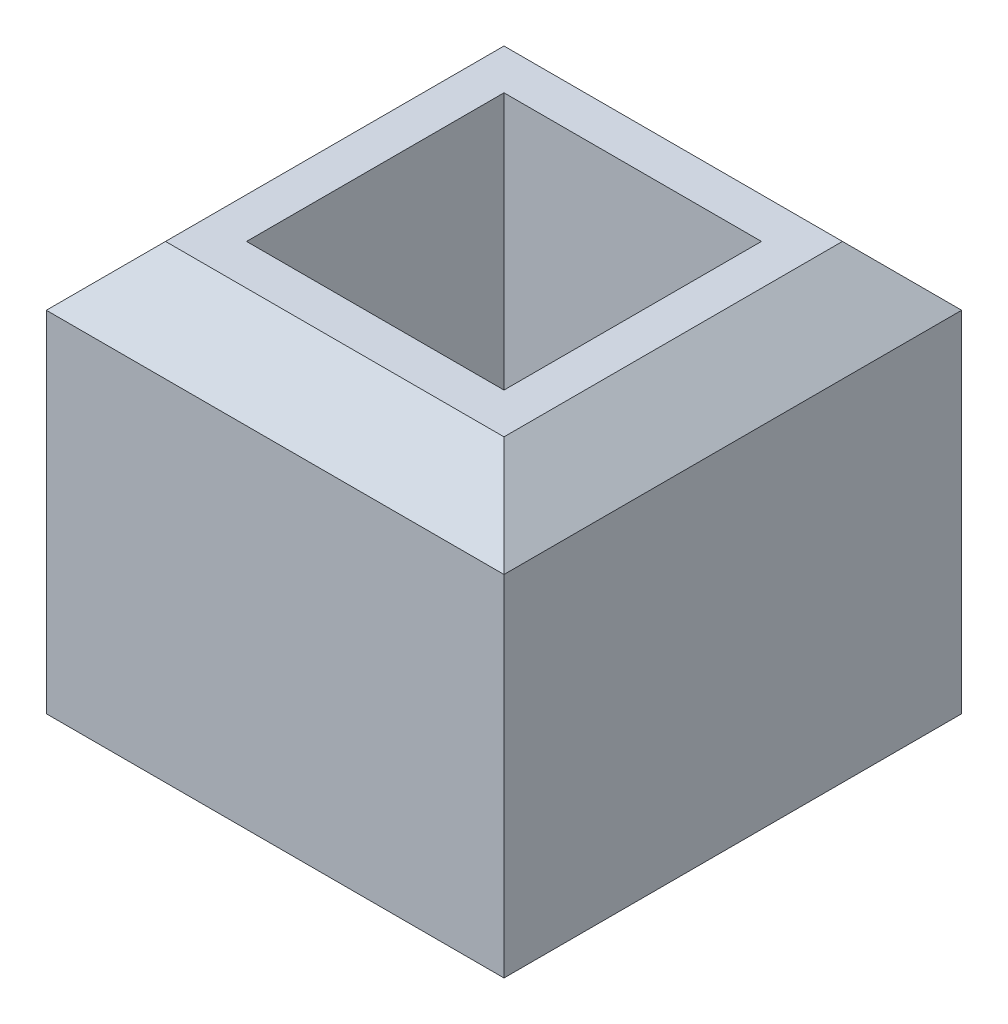
ISO-10303-21;
HEADER;
FILE_DESCRIPTION(('STEP AP214'),'2;1');
FILE_NAME('part.step','',(''),(''),'','','');
FILE_SCHEMA(('AUTOMOTIVE_DESIGN { 1 0 10303 214 1 1 1 1 }'));
ENDSEC;
DATA;
#1=APPLICATION_CONTEXT('core data for automotive mechanical design processes');
#2=APPLICATION_PROTOCOL_DEFINITION('international standard','automotive_design',2000,#1);
#3=PRODUCT_CONTEXT('',#1,'mechanical');
#4=PRODUCT('Part','Part','',(#3));
#5=PRODUCT_RELATED_PRODUCT_CATEGORY('part','',(#4));
#6=PRODUCT_DEFINITION_FORMATION('','',#4);
#7=PRODUCT_DEFINITION_CONTEXT('part definition',#1,'design');
#8=PRODUCT_DEFINITION('design','',#6,#7);
#9=PRODUCT_DEFINITION_SHAPE('','',#8);
#10=(LENGTH_UNIT() NAMED_UNIT(*) SI_UNIT(.MILLI.,.METRE.));
#11=(NAMED_UNIT(*) PLANE_ANGLE_UNIT() SI_UNIT($,.RADIAN.));
#12=(NAMED_UNIT(*) SI_UNIT($,.STERADIAN.) SOLID_ANGLE_UNIT());
#13=UNCERTAINTY_MEASURE_WITH_UNIT(LENGTH_MEASURE(1.E-05),#10,'distance_accuracy_value','');
#14=(GEOMETRIC_REPRESENTATION_CONTEXT(3) GLOBAL_UNCERTAINTY_ASSIGNED_CONTEXT((#13)) GLOBAL_UNIT_ASSIGNED_CONTEXT((#10,
#11,#12)) REPRESENTATION_CONTEXT('',''));
#15=CARTESIAN_POINT('',(0.,0.,0.));
#16=DIRECTION('',(0.,0.,1.));
#17=DIRECTION('',(1.,0.,0.));
#18=AXIS2_PLACEMENT_3D('',#15,#16,#17);
#19=CARTESIAN_POINT('',(0.,5.4483,0.));
#20=DIRECTION('',(0.,1.,0.));
#21=DIRECTION('',(0.,0.,1.));
#22=AXIS2_PLACEMENT_3D('',#19,#20,#21);
#23=PLANE('',#22);
#24=DIRECTION('',(-1.,0.,0.));
#25=VECTOR('',#24,1.);
#26=CARTESIAN_POINT('',(-3.048,5.4483,-2.25425));
#27=LINE('',#26,#25);
#28=CARTESIAN_POINT('',(2.25425,5.4483,-2.25425));
#29=VERTEX_POINT('',#28);
#30=CARTESIAN_POINT('',(-2.25425,5.4483,-2.25425));
#31=VERTEX_POINT('',#30);
#32=EDGE_CURVE('E214',#29,#31,#27,.T.);
#33=ORIENTED_EDGE('',*,*,#32,.T.);
#34=DIRECTION('',(0.,0.,1.));
#35=VECTOR('',#34,1.);
#36=CARTESIAN_POINT('',(-2.25425,5.4483,3.048));
#37=LINE('',#36,#35);
#38=CARTESIAN_POINT('',(-2.25425,5.4483,2.25425));
#39=VERTEX_POINT('',#38);
#40=EDGE_CURVE('E217',#31,#39,#37,.T.);
#41=ORIENTED_EDGE('',*,*,#40,.T.);
#42=DIRECTION('',(1.,0.,0.));
#43=VECTOR('',#42,1.);
#44=CARTESIAN_POINT('',(3.048,5.4483,2.25425));
#45=LINE('',#44,#43);
#46=CARTESIAN_POINT('',(2.25425,5.4483,2.25425));
#47=VERTEX_POINT('',#46);
#48=EDGE_CURVE('E208',#39,#47,#45,.T.);
#49=ORIENTED_EDGE('',*,*,#48,.T.);
#50=DIRECTION('',(0.,0.,-1.));
#51=VECTOR('',#50,1.);
#52=CARTESIAN_POINT('',(2.25425,5.4483,-3.048));
#53=LINE('',#52,#51);
#54=EDGE_CURVE('E211',#47,#29,#53,.T.);
#55=ORIENTED_EDGE('',*,*,#54,.T.);
#56=EDGE_LOOP('',(#33,#41,#49,#55));
#57=FACE_BOUND('',#56,.T.);
#58=DIRECTION('',(-1.,0.,0.));
#59=VECTOR('',#58,1.);
#60=CARTESIAN_POINT('',(-1.7145,5.4483,-1.7145));
#61=LINE('',#60,#59);
#62=CARTESIAN_POINT('',(1.7145,5.4483,-1.7145));
#63=VERTEX_POINT('',#62);
#64=CARTESIAN_POINT('',(-1.7145,5.4483,-1.7145));
#65=VERTEX_POINT('',#64);
#66=EDGE_CURVE('E139',#63,#65,#61,.T.);
#67=ORIENTED_EDGE('',*,*,#66,.F.);
#68=DIRECTION('',(0.,0.,-1.));
#69=VECTOR('',#68,1.);
#70=CARTESIAN_POINT('',(1.7145,5.4483,-1.7145));
#71=LINE('',#70,#69);
#72=CARTESIAN_POINT('',(1.7145,5.4483,1.7145));
#73=VERTEX_POINT('',#72);
#74=EDGE_CURVE('E128',#73,#63,#71,.T.);
#75=ORIENTED_EDGE('',*,*,#74,.F.);
#76=DIRECTION('',(1.,0.,0.));
#77=VECTOR('',#76,1.);
#78=CARTESIAN_POINT('',(-1.7145,5.4483,1.7145));
#79=LINE('',#78,#77);
#80=CARTESIAN_POINT('',(-1.7145,5.4483,1.7145));
#81=VERTEX_POINT('',#80);
#82=EDGE_CURVE('E157',#81,#73,#79,.T.);
#83=ORIENTED_EDGE('',*,*,#82,.F.);
#84=DIRECTION('',(0.,0.,1.));
#85=VECTOR('',#84,1.);
#86=CARTESIAN_POINT('',(-1.7145,5.4483,-1.7145));
#87=LINE('',#86,#85);
#88=EDGE_CURVE('E153',#65,#81,#87,.T.);
#89=ORIENTED_EDGE('',*,*,#88,.F.);
#90=EDGE_LOOP('',(#67,#75,#83,#89));
#91=FACE_BOUND('',#90,.T.);
#92=ADVANCED_FACE('F47',(#57,#91),#23,.T.);
#93=CARTESIAN_POINT('',(0.,0.,0.));
#94=DIRECTION('',(0.,1.,0.));
#95=DIRECTION('',(0.,0.,1.));
#96=AXIS2_PLACEMENT_3D('',#93,#94,#95);
#97=PLANE('',#96);
#98=DIRECTION('',(0.,0.,-1.));
#99=VECTOR('',#98,1.);
#100=CARTESIAN_POINT('',(3.048,0.,-3.048));
#101=LINE('',#100,#99);
#102=CARTESIAN_POINT('',(3.048,0.,3.048));
#103=VERTEX_POINT('',#102);
#104=CARTESIAN_POINT('',(3.048,0.,-3.048));
#105=VERTEX_POINT('',#104);
#106=EDGE_CURVE('E148',#103,#105,#101,.T.);
#107=ORIENTED_EDGE('',*,*,#106,.F.);
#108=DIRECTION('',(1.,0.,0.));
#109=VECTOR('',#108,1.);
#110=CARTESIAN_POINT('',(-3.048,0.,3.048));
#111=LINE('',#110,#109);
#112=CARTESIAN_POINT('',(-3.048,0.,3.048));
#113=VERTEX_POINT('',#112);
#114=EDGE_CURVE('E192',#113,#103,#111,.T.);
#115=ORIENTED_EDGE('',*,*,#114,.F.);
#116=DIRECTION('',(0.,0.,1.));
#117=VECTOR('',#116,1.);
#118=CARTESIAN_POINT('',(-3.048,0.,-3.048));
#119=LINE('',#118,#117);
#120=CARTESIAN_POINT('',(-3.048,0.,-3.048));
#121=VERTEX_POINT('',#120);
#122=EDGE_CURVE('E188',#121,#113,#119,.T.);
#123=ORIENTED_EDGE('',*,*,#122,.F.);
#124=DIRECTION('',(-1.,0.,0.));
#125=VECTOR('',#124,1.);
#126=CARTESIAN_POINT('',(-3.048,0.,-3.048));
#127=LINE('',#126,#125);
#128=EDGE_CURVE('E184',#105,#121,#127,.T.);
#129=ORIENTED_EDGE('',*,*,#128,.F.);
#130=EDGE_LOOP('',(#107,#115,#123,#129));
#131=FACE_BOUND('',#130,.T.);
#132=DIRECTION('',(0.,0.,-1.));
#133=VECTOR('',#132,1.);
#134=CARTESIAN_POINT('',(1.7145,0.,-1.7145));
#135=LINE('',#134,#133);
#136=CARTESIAN_POINT('',(1.7145,0.,1.7145));
#137=VERTEX_POINT('',#136);
#138=CARTESIAN_POINT('',(1.7145,0.,-1.7145));
#139=VERTEX_POINT('',#138);
#140=EDGE_CURVE('E162',#137,#139,#135,.T.);
#141=ORIENTED_EDGE('',*,*,#140,.T.);
#142=DIRECTION('',(-1.,0.,0.));
#143=VECTOR('',#142,1.);
#144=CARTESIAN_POINT('',(-1.7145,0.,-1.7145));
#145=LINE('',#144,#143);
#146=CARTESIAN_POINT('',(-1.7145,0.,-1.7145));
#147=VERTEX_POINT('',#146);
#148=EDGE_CURVE('E146',#139,#147,#145,.T.);
#149=ORIENTED_EDGE('',*,*,#148,.T.);
#150=DIRECTION('',(0.,0.,1.));
#151=VECTOR('',#150,1.);
#152=CARTESIAN_POINT('',(-1.7145,0.,-1.7145));
#153=LINE('',#152,#151);
#154=CARTESIAN_POINT('',(-1.7145,0.,1.7145));
#155=VERTEX_POINT('',#154);
#156=EDGE_CURVE('E167',#147,#155,#153,.T.);
#157=ORIENTED_EDGE('',*,*,#156,.T.);
#158=DIRECTION('',(1.,0.,0.));
#159=VECTOR('',#158,1.);
#160=CARTESIAN_POINT('',(-1.7145,0.,1.7145));
#161=LINE('',#160,#159);
#162=EDGE_CURVE('E140',#155,#137,#161,.T.);
#163=ORIENTED_EDGE('',*,*,#162,.T.);
#164=EDGE_LOOP('',(#141,#149,#157,#163));
#165=FACE_BOUND('',#164,.T.);
#166=ADVANCED_FACE('F265',(#131,#165),#97,.F.);
#167=CARTESIAN_POINT('',(3.048,5.4483,-3.048));
#168=DIRECTION('',(-1.,0.,0.));
#169=DIRECTION('',(0.,0.,1.));
#170=AXIS2_PLACEMENT_3D('',#167,#168,#169);
#171=PLANE('',#170);
#172=DIRECTION('',(0.,-1.,0.));
#173=VECTOR('',#172,1.);
#174=CARTESIAN_POINT('',(3.048,5.4483,-3.048));
#175=LINE('',#174,#173);
#176=CARTESIAN_POINT('',(3.048,4.65455,-3.048));
#177=VERTEX_POINT('',#176);
#178=EDGE_CURVE('E205',#177,#105,#175,.T.);
#179=ORIENTED_EDGE('',*,*,#178,.F.);
#180=DIRECTION('',(0.,0.,1.));
#181=VECTOR('',#180,1.);
#182=CARTESIAN_POINT('',(3.048,4.65455,3.048));
#183=LINE('',#182,#181);
#184=CARTESIAN_POINT('',(3.048,4.65455,3.048));
#185=VERTEX_POINT('',#184);
#186=EDGE_CURVE('E58',#177,#185,#183,.T.);
#187=ORIENTED_EDGE('',*,*,#186,.T.);
#188=DIRECTION('',(0.,-1.,0.));
#189=VECTOR('',#188,1.);
#190=CARTESIAN_POINT('',(3.048,5.4483,3.048));
#191=LINE('',#190,#189);
#192=EDGE_CURVE('E196',#185,#103,#191,.T.);
#193=ORIENTED_EDGE('',*,*,#192,.T.);
#194=ORIENTED_EDGE('',*,*,#106,.T.);
#195=EDGE_LOOP('',(#179,#187,#193,#194));
#196=FACE_BOUND('',#195,.T.);
#197=ADVANCED_FACE('F272',(#196),#171,.F.);
#198=CARTESIAN_POINT('',(-3.048,5.4483,-3.048));
#199=DIRECTION('',(0.,0.,1.));
#200=DIRECTION('',(1.,0.,0.));
#201=AXIS2_PLACEMENT_3D('',#198,#199,#200);
#202=PLANE('',#201);
#203=DIRECTION('',(0.,-1.,0.));
#204=VECTOR('',#203,1.);
#205=CARTESIAN_POINT('',(-3.048,5.4483,-3.048));
#206=LINE('',#205,#204);
#207=CARTESIAN_POINT('',(-3.048,4.65455,-3.048));
#208=VERTEX_POINT('',#207);
#209=EDGE_CURVE('E202',#208,#121,#206,.T.);
#210=ORIENTED_EDGE('',*,*,#209,.F.);
#211=DIRECTION('',(1.,0.,0.));
#212=VECTOR('',#211,1.);
#213=CARTESIAN_POINT('',(3.048,4.65455,-3.048));
#214=LINE('',#213,#212);
#215=EDGE_CURVE('E73',#208,#177,#214,.T.);
#216=ORIENTED_EDGE('',*,*,#215,.T.);
#217=ORIENTED_EDGE('',*,*,#178,.T.);
#218=ORIENTED_EDGE('',*,*,#128,.T.);
#219=EDGE_LOOP('',(#210,#216,#217,#218));
#220=FACE_BOUND('',#219,.T.);
#221=ADVANCED_FACE('F282',(#220),#202,.F.);
#222=CARTESIAN_POINT('',(-3.048,5.4483,-3.048));
#223=DIRECTION('',(1.,0.,0.));
#224=DIRECTION('',(0.,0.,-1.));
#225=AXIS2_PLACEMENT_3D('',#222,#223,#224);
#226=PLANE('',#225);
#227=DIRECTION('',(0.,-1.,0.));
#228=VECTOR('',#227,1.);
#229=CARTESIAN_POINT('',(-3.048,5.4483,3.048));
#230=LINE('',#229,#228);
#231=CARTESIAN_POINT('',(-3.048,4.65455,3.048));
#232=VERTEX_POINT('',#231);
#233=EDGE_CURVE('E199',#232,#113,#230,.T.);
#234=ORIENTED_EDGE('',*,*,#233,.F.);
#235=DIRECTION('',(0.,0.,-1.));
#236=VECTOR('',#235,1.);
#237=CARTESIAN_POINT('',(-3.048,4.65455,-3.048));
#238=LINE('',#237,#236);
#239=EDGE_CURVE('E221',#232,#208,#238,.T.);
#240=ORIENTED_EDGE('',*,*,#239,.T.);
#241=ORIENTED_EDGE('',*,*,#209,.T.);
#242=ORIENTED_EDGE('',*,*,#122,.T.);
#243=EDGE_LOOP('',(#234,#240,#241,#242));
#244=FACE_BOUND('',#243,.T.);
#245=ADVANCED_FACE('F257',(#244),#226,.F.);
#246=CARTESIAN_POINT('',(-3.048,5.4483,3.048));
#247=DIRECTION('',(0.,0.,-1.));
#248=DIRECTION('',(-1.,0.,0.));
#249=AXIS2_PLACEMENT_3D('',#246,#247,#248);
#250=PLANE('',#249);
#251=ORIENTED_EDGE('',*,*,#192,.F.);
#252=DIRECTION('',(-1.,0.,0.));
#253=VECTOR('',#252,1.);
#254=CARTESIAN_POINT('',(-3.048,4.65455,3.048));
#255=LINE('',#254,#253);
#256=EDGE_CURVE('E11',#185,#232,#255,.T.);
#257=ORIENTED_EDGE('',*,*,#256,.T.);
#258=ORIENTED_EDGE('',*,*,#233,.T.);
#259=ORIENTED_EDGE('',*,*,#114,.T.);
#260=EDGE_LOOP('',(#251,#257,#258,#259));
#261=FACE_BOUND('',#260,.T.);
#262=ADVANCED_FACE('F254',(#261),#250,.F.);
#263=CARTESIAN_POINT('',(1.7145,5.4483,-1.7145));
#264=DIRECTION('',(-1.,0.,0.));
#265=DIRECTION('',(0.,0.,1.));
#266=AXIS2_PLACEMENT_3D('',#263,#264,#265);
#267=PLANE('',#266);
#268=ORIENTED_EDGE('',*,*,#140,.F.);
#269=DIRECTION('',(0.,-1.,0.));
#270=VECTOR('',#269,1.);
#271=CARTESIAN_POINT('',(1.7145,5.4483,1.7145));
#272=LINE('',#271,#270);
#273=EDGE_CURVE('E134',#73,#137,#272,.T.);
#274=ORIENTED_EDGE('',*,*,#273,.F.);
#275=ORIENTED_EDGE('',*,*,#74,.T.);
#276=DIRECTION('',(0.,-1.,0.));
#277=VECTOR('',#276,1.);
#278=CARTESIAN_POINT('',(1.7145,5.4483,-1.7145));
#279=LINE('',#278,#277);
#280=EDGE_CURVE('E131',#63,#139,#279,.T.);
#281=ORIENTED_EDGE('',*,*,#280,.T.);
#282=EDGE_LOOP('',(#268,#274,#275,#281));
#283=FACE_BOUND('',#282,.T.);
#284=ADVANCED_FACE('F130',(#283),#267,.T.);
#285=CARTESIAN_POINT('',(-1.7145,5.4483,-1.7145));
#286=DIRECTION('',(0.,0.,1.));
#287=DIRECTION('',(1.,0.,0.));
#288=AXIS2_PLACEMENT_3D('',#285,#286,#287);
#289=PLANE('',#288);
#290=ORIENTED_EDGE('',*,*,#148,.F.);
#291=ORIENTED_EDGE('',*,*,#280,.F.);
#292=ORIENTED_EDGE('',*,*,#66,.T.);
#293=DIRECTION('',(0.,-1.,0.));
#294=VECTOR('',#293,1.);
#295=CARTESIAN_POINT('',(-1.7145,5.4483,-1.7145));
#296=LINE('',#295,#294);
#297=EDGE_CURVE('E149',#65,#147,#296,.T.);
#298=ORIENTED_EDGE('',*,*,#297,.T.);
#299=EDGE_LOOP('',(#290,#291,#292,#298));
#300=FACE_BOUND('',#299,.T.);
#301=ADVANCED_FACE('F143',(#300),#289,.T.);
#302=CARTESIAN_POINT('',(-1.7145,5.4483,-1.7145));
#303=DIRECTION('',(1.,0.,0.));
#304=DIRECTION('',(0.,0.,-1.));
#305=AXIS2_PLACEMENT_3D('',#302,#303,#304);
#306=PLANE('',#305);
#307=ORIENTED_EDGE('',*,*,#156,.F.);
#308=ORIENTED_EDGE('',*,*,#297,.F.);
#309=ORIENTED_EDGE('',*,*,#88,.T.);
#310=DIRECTION('',(0.,-1.,0.));
#311=VECTOR('',#310,1.);
#312=CARTESIAN_POINT('',(-1.7145,5.4483,1.7145));
#313=LINE('',#312,#311);
#314=EDGE_CURVE('E176',#81,#155,#313,.T.);
#315=ORIENTED_EDGE('',*,*,#314,.T.);
#316=EDGE_LOOP('',(#307,#308,#309,#315));
#317=FACE_BOUND('',#316,.T.);
#318=ADVANCED_FACE('F305',(#317),#306,.T.);
#319=CARTESIAN_POINT('',(-1.7145,5.4483,1.7145));
#320=DIRECTION('',(0.,0.,-1.));
#321=DIRECTION('',(-1.,0.,0.));
#322=AXIS2_PLACEMENT_3D('',#319,#320,#321);
#323=PLANE('',#322);
#324=ORIENTED_EDGE('',*,*,#162,.F.);
#325=ORIENTED_EDGE('',*,*,#314,.F.);
#326=ORIENTED_EDGE('',*,*,#82,.T.);
#327=ORIENTED_EDGE('',*,*,#273,.T.);
#328=EDGE_LOOP('',(#324,#325,#326,#327));
#329=FACE_BOUND('',#328,.T.);
#330=ADVANCED_FACE('F302',(#329),#323,.T.);
#331=CARTESIAN_POINT('',(2.25425,5.4483,0.));
#332=DIRECTION('',(0.707106781186548,0.707106781186547,0.));
#333=DIRECTION('',(0.,0.,1.));
#334=AXIS2_PLACEMENT_3D('',#331,#332,#333);
#335=PLANE('',#334);
#336=DIRECTION('',(-0.577350269189625,0.577350269189627,-0.577350269189625));
#337=VECTOR('',#336,1.);
#338=CARTESIAN_POINT('',(1.50283333333333,6.19971666666667,1.50283333333333));
#339=LINE('',#338,#337);
#340=EDGE_CURVE('E234',#185,#47,#339,.T.);
#341=ORIENTED_EDGE('',*,*,#340,.F.);
#342=ORIENTED_EDGE('',*,*,#186,.F.);
#343=DIRECTION('',(-0.577350269189625,0.577350269189627,0.577350269189625));
#344=VECTOR('',#343,1.);
#345=CARTESIAN_POINT('',(1.50283333333333,6.19971666666667,-1.50283333333333));
#346=LINE('',#345,#344);
#347=EDGE_CURVE('E52',#29,#177,#346,.F.);
#348=ORIENTED_EDGE('',*,*,#347,.F.);
#349=ORIENTED_EDGE('',*,*,#54,.F.);
#350=EDGE_LOOP('',(#341,#342,#348,#349));
#351=FACE_BOUND('',#350,.T.);
#352=ADVANCED_FACE('F50',(#351),#335,.T.);
#353=CARTESIAN_POINT('',(0.,5.4483,-2.25425));
#354=DIRECTION('',(0.,0.707106781186547,-0.707106781186548));
#355=DIRECTION('',(1.,0.,0.));
#356=AXIS2_PLACEMENT_3D('',#353,#354,#355);
#357=PLANE('',#356);
#358=ORIENTED_EDGE('',*,*,#347,.T.);
#359=ORIENTED_EDGE('',*,*,#215,.F.);
#360=DIRECTION('',(0.577350269189625,0.577350269189627,0.577350269189625));
#361=VECTOR('',#360,1.);
#362=CARTESIAN_POINT('',(-1.50283333333333,6.19971666666667,-1.50283333333333));
#363=LINE('',#362,#361);
#364=EDGE_CURVE('E232',#31,#208,#363,.F.);
#365=ORIENTED_EDGE('',*,*,#364,.F.);
#366=ORIENTED_EDGE('',*,*,#32,.F.);
#367=EDGE_LOOP('',(#358,#359,#365,#366));
#368=FACE_BOUND('',#367,.T.);
#369=ADVANCED_FACE('F246',(#368),#357,.T.);
#370=CARTESIAN_POINT('',(0.,5.4483,2.25425));
#371=DIRECTION('',(0.,0.707106781186547,0.707106781186548));
#372=DIRECTION('',(-1.,0.,0.));
#373=AXIS2_PLACEMENT_3D('',#370,#371,#372);
#374=PLANE('',#373);
#375=ORIENTED_EDGE('',*,*,#340,.T.);
#376=ORIENTED_EDGE('',*,*,#48,.F.);
#377=DIRECTION('',(-0.577350269189625,-0.577350269189627,0.577350269189625));
#378=VECTOR('',#377,1.);
#379=CARTESIAN_POINT('',(-1.50283333333333,6.19971666666667,1.50283333333333));
#380=LINE('',#379,#378);
#381=EDGE_CURVE('E229',#232,#39,#380,.F.);
#382=ORIENTED_EDGE('',*,*,#381,.F.);
#383=ORIENTED_EDGE('',*,*,#256,.F.);
#384=EDGE_LOOP('',(#375,#376,#382,#383));
#385=FACE_BOUND('',#384,.T.);
#386=ADVANCED_FACE('F251',(#385),#374,.T.);
#387=CARTESIAN_POINT('',(-2.25425,5.4483,0.));
#388=DIRECTION('',(-0.707106781186548,0.707106781186547,0.));
#389=DIRECTION('',(0.,0.,-1.));
#390=AXIS2_PLACEMENT_3D('',#387,#388,#389);
#391=PLANE('',#390);
#392=ORIENTED_EDGE('',*,*,#364,.T.);
#393=ORIENTED_EDGE('',*,*,#239,.F.);
#394=ORIENTED_EDGE('',*,*,#381,.T.);
#395=ORIENTED_EDGE('',*,*,#40,.F.);
#396=EDGE_LOOP('',(#392,#393,#394,#395));
#397=FACE_BOUND('',#396,.T.);
#398=ADVANCED_FACE('F261',(#397),#391,.T.);
#399=CLOSED_SHELL('',(#92,#166,#197,#221,#245,#262,#284,#301,#318,#330,#352,#369,#386,#398));
#400=MANIFOLD_SOLID_BREP('B2',#399);
#401=ADVANCED_BREP_SHAPE_REPRESENTATION('',(#18,#400),#14);
#402=SHAPE_DEFINITION_REPRESENTATION(#9,#401);
ENDSEC;
END-ISO-10303-21;
